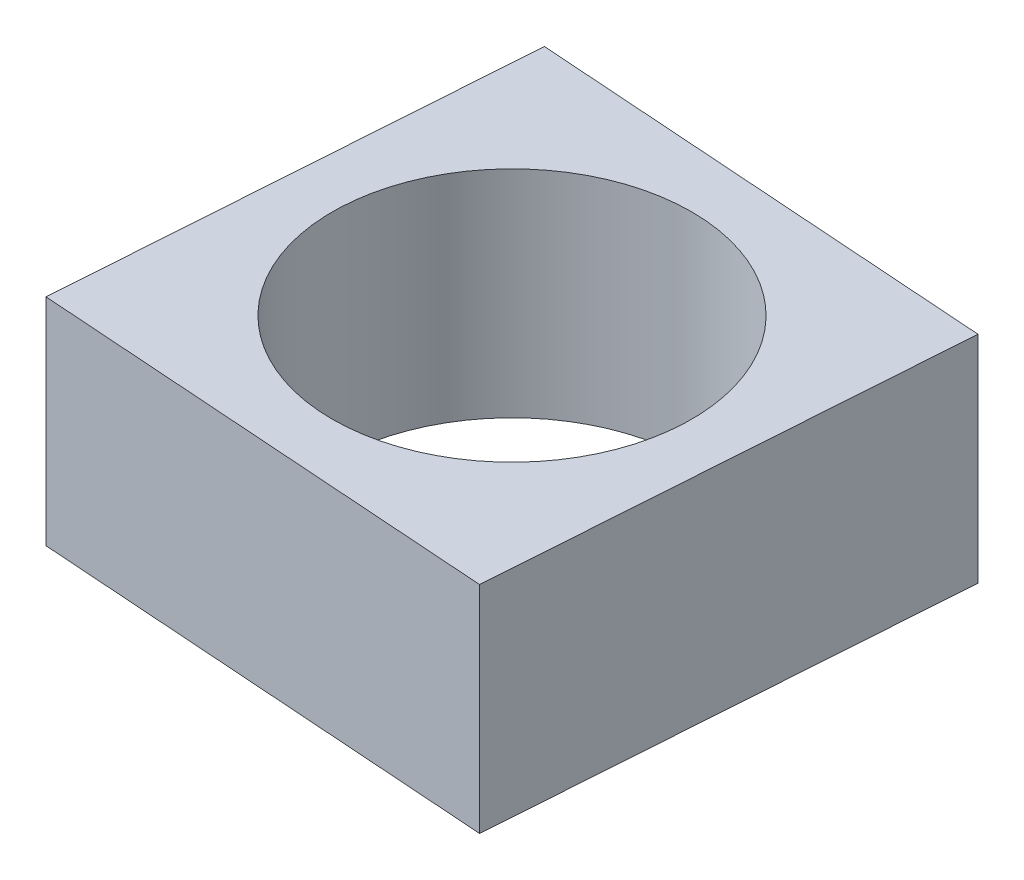
ISO-10303-21;
HEADER;
FILE_DESCRIPTION(('STEP AP214'),'2;1');
FILE_NAME('part.step','',(''),(''),'','','');
FILE_SCHEMA(('AUTOMOTIVE_DESIGN { 1 0 10303 214 1 1 1 1 }'));
ENDSEC;
DATA;
#1=APPLICATION_CONTEXT('core data for automotive mechanical design processes');
#2=APPLICATION_PROTOCOL_DEFINITION('international standard','automotive_design',2000,#1);
#3=PRODUCT_CONTEXT('',#1,'mechanical');
#4=PRODUCT('Part','Part','',(#3));
#5=PRODUCT_RELATED_PRODUCT_CATEGORY('part','',(#4));
#6=PRODUCT_DEFINITION_FORMATION('','',#4);
#7=PRODUCT_DEFINITION_CONTEXT('part definition',#1,'design');
#8=PRODUCT_DEFINITION('design','',#6,#7);
#9=PRODUCT_DEFINITION_SHAPE('','',#8);
#10=(LENGTH_UNIT() NAMED_UNIT(*) SI_UNIT(.MILLI.,.METRE.));
#11=(NAMED_UNIT(*) PLANE_ANGLE_UNIT() SI_UNIT($,.RADIAN.));
#12=(NAMED_UNIT(*) SI_UNIT($,.STERADIAN.) SOLID_ANGLE_UNIT());
#13=UNCERTAINTY_MEASURE_WITH_UNIT(LENGTH_MEASURE(1.E-05),#10,'distance_accuracy_value','');
#14=(GEOMETRIC_REPRESENTATION_CONTEXT(3) GLOBAL_UNCERTAINTY_ASSIGNED_CONTEXT((#13)) GLOBAL_UNIT_ASSIGNED_CONTEXT((#10,
#11,#12)) REPRESENTATION_CONTEXT('',''));
#15=CARTESIAN_POINT('',(0.,0.,0.));
#16=DIRECTION('',(0.,0.,1.));
#17=DIRECTION('',(1.,0.,0.));
#18=AXIS2_PLACEMENT_3D('',#15,#16,#17);
#19=CARTESIAN_POINT('',(-6.48435069474378,3.,-0.450772744934531));
#20=DIRECTION('',(0.069349653066851,0.,-0.997592414575967));
#21=DIRECTION('',(-0.997592414575967,0.,-0.069349653066851));
#22=AXIS2_PLACEMENT_3D('',#19,#20,#21);
#23=PLANE('',#22);
#24=DIRECTION('',(0.997592414575967,0.,0.069349653066851));
#25=VECTOR('',#24,1.);
#26=CARTESIAN_POINT('',(-6.48435069474378,0.,-0.450772744934531));
#27=LINE('',#26,#25);
#28=CARTESIAN_POINT('',(-6.48435069474378,0.,-0.450772744934531));
#29=VERTEX_POINT('',#28);
#30=CARTESIAN_POINT('',(0.,0.,0.));
#31=VERTEX_POINT('',#30);
#32=EDGE_CURVE('E107',#29,#31,#27,.T.);
#33=ORIENTED_EDGE('',*,*,#32,.T.);
#34=DIRECTION('',(0.,-1.,0.));
#35=VECTOR('',#34,1.);
#36=CARTESIAN_POINT('',(0.,3.,0.));
#37=LINE('',#36,#35);
#38=CARTESIAN_POINT('',(0.,3.,0.));
#39=VERTEX_POINT('',#38);
#40=EDGE_CURVE('E11',#39,#31,#37,.T.);
#41=ORIENTED_EDGE('',*,*,#40,.F.);
#42=DIRECTION('',(0.997592414575967,0.,0.069349653066851));
#43=VECTOR('',#42,1.);
#44=CARTESIAN_POINT('',(-6.48435069474378,3.,-0.450772744934531));
#45=LINE('',#44,#43);
#46=CARTESIAN_POINT('',(-6.48435069474378,3.,-0.450772744934531));
#47=VERTEX_POINT('',#46);
#48=EDGE_CURVE('E91',#47,#39,#45,.T.);
#49=ORIENTED_EDGE('',*,*,#48,.F.);
#50=DIRECTION('',(0.,-1.,0.));
#51=VECTOR('',#50,1.);
#52=CARTESIAN_POINT('',(-6.48435069474378,3.,-0.450772744934531));
#53=LINE('',#52,#51);
#54=EDGE_CURVE('E103',#47,#29,#53,.T.);
#55=ORIENTED_EDGE('',*,*,#54,.T.);
#56=EDGE_LOOP('',(#33,#41,#49,#55));
#57=FACE_BOUND('',#56,.T.);
#58=ADVANCED_FACE('F39',(#57),#23,.F.);
#59=CARTESIAN_POINT('',(0.,3.,0.));
#60=DIRECTION('',(-0.997592414575967,0.,-0.0693496530668509));
#61=DIRECTION('',(-0.0693496530668509,0.,0.997592414575967));
#62=AXIS2_PLACEMENT_3D('',#59,#60,#61);
#63=PLANE('',#62);
#64=DIRECTION('',(0.0693496530668509,0.,-0.997592414575967));
#65=VECTOR('',#64,1.);
#66=CARTESIAN_POINT('',(0.,0.,0.));
#67=LINE('',#66,#65);
#68=CARTESIAN_POINT('',(0.450772744934531,0.,-6.48435069474378));
#69=VERTEX_POINT('',#68);
#70=EDGE_CURVE('E96',#31,#69,#67,.T.);
#71=ORIENTED_EDGE('',*,*,#70,.T.);
#72=DIRECTION('',(0.,-1.,0.));
#73=VECTOR('',#72,1.);
#74=CARTESIAN_POINT('',(0.450772744934531,3.,-6.48435069474378));
#75=LINE('',#74,#73);
#76=CARTESIAN_POINT('',(0.450772744934531,3.,-6.48435069474378));
#77=VERTEX_POINT('',#76);
#78=EDGE_CURVE('E48',#77,#69,#75,.T.);
#79=ORIENTED_EDGE('',*,*,#78,.F.);
#80=DIRECTION('',(0.0693496530668509,0.,-0.997592414575967));
#81=VECTOR('',#80,1.);
#82=CARTESIAN_POINT('',(0.,3.,0.));
#83=LINE('',#82,#81);
#84=EDGE_CURVE('E86',#39,#77,#83,.T.);
#85=ORIENTED_EDGE('',*,*,#84,.F.);
#86=ORIENTED_EDGE('',*,*,#40,.T.);
#87=EDGE_LOOP('',(#71,#79,#85,#86));
#88=FACE_BOUND('',#87,.T.);
#89=ADVANCED_FACE('F95',(#88),#63,.F.);
#90=CARTESIAN_POINT('',(0.450772744934531,3.,-6.48435069474378));
#91=DIRECTION('',(-0.0693496530668509,0.,0.997592414575967));
#92=DIRECTION('',(0.997592414575967,0.,0.0693496530668509));
#93=AXIS2_PLACEMENT_3D('',#90,#91,#92);
#94=PLANE('',#93);
#95=DIRECTION('',(-0.997592414575967,0.,-0.0693496530668509));
#96=VECTOR('',#95,1.);
#97=CARTESIAN_POINT('',(0.450772744934531,0.,-6.48435069474378));
#98=LINE('',#97,#96);
#99=CARTESIAN_POINT('',(-6.03357794980925,0.,-6.93512343967831));
#100=VERTEX_POINT('',#99);
#101=EDGE_CURVE('E73',#69,#100,#98,.T.);
#102=ORIENTED_EDGE('',*,*,#101,.T.);
#103=DIRECTION('',(0.,-1.,0.));
#104=VECTOR('',#103,1.);
#105=CARTESIAN_POINT('',(-6.03357794980925,3.,-6.93512343967831));
#106=LINE('',#105,#104);
#107=CARTESIAN_POINT('',(-6.03357794980925,3.,-6.93512343967831));
#108=VERTEX_POINT('',#107);
#109=EDGE_CURVE('E98',#108,#100,#106,.T.);
#110=ORIENTED_EDGE('',*,*,#109,.F.);
#111=DIRECTION('',(-0.997592414575967,0.,-0.0693496530668509));
#112=VECTOR('',#111,1.);
#113=CARTESIAN_POINT('',(0.450772744934531,3.,-6.48435069474378));
#114=LINE('',#113,#112);
#115=EDGE_CURVE('E89',#77,#108,#114,.T.);
#116=ORIENTED_EDGE('',*,*,#115,.F.);
#117=ORIENTED_EDGE('',*,*,#78,.T.);
#118=EDGE_LOOP('',(#102,#110,#116,#117));
#119=FACE_BOUND('',#118,.T.);
#120=ADVANCED_FACE('F99',(#119),#94,.F.);
#121=CARTESIAN_POINT('',(-6.03357794980925,3.,-6.93512343967831));
#122=DIRECTION('',(0.997592414575967,0.,0.0693496530668505));
#123=DIRECTION('',(0.0693496530668505,0.,-0.997592414575967));
#124=AXIS2_PLACEMENT_3D('',#121,#122,#123);
#125=PLANE('',#124);
#126=DIRECTION('',(-0.0693496530668505,0.,0.997592414575967));
#127=VECTOR('',#126,1.);
#128=CARTESIAN_POINT('',(-6.03357794980925,0.,-6.93512343967831));
#129=LINE('',#128,#127);
#130=EDGE_CURVE('E79',#100,#29,#129,.T.);
#131=ORIENTED_EDGE('',*,*,#130,.T.);
#132=ORIENTED_EDGE('',*,*,#54,.F.);
#133=DIRECTION('',(-0.0693496530668505,0.,0.997592414575967));
#134=VECTOR('',#133,1.);
#135=CARTESIAN_POINT('',(-6.03357794980925,3.,-6.93512343967831));
#136=LINE('',#135,#134);
#137=EDGE_CURVE('E56',#108,#47,#136,.T.);
#138=ORIENTED_EDGE('',*,*,#137,.F.);
#139=ORIENTED_EDGE('',*,*,#109,.T.);
#140=EDGE_LOOP('',(#131,#132,#138,#139));
#141=FACE_BOUND('',#140,.T.);
#142=ADVANCED_FACE('F121',(#141),#125,.F.);
#143=CARTESIAN_POINT('',(0.,3.,0.));
#144=DIRECTION('',(0.,1.,0.));
#145=DIRECTION('',(0.,0.,1.));
#146=AXIS2_PLACEMENT_3D('',#143,#144,#145);
#147=PLANE('',#146);
#148=CARTESIAN_POINT('',(-3.01678897490463,3.,-3.46756171983916));
#149=DIRECTION('',(0.,1.,0.));
#150=DIRECTION('',(0.,0.,1.));
#151=AXIS2_PLACEMENT_3D('',#148,#149,#150);
#152=CIRCLE('',#151,2.5);
#153=CARTESIAN_POINT('',(-3.01678897490463,3.,-0.967561719839157));
#154=VERTEX_POINT('',#153);
#155=EDGE_CURVE('E128',#154,#154,#152,.T.);
#156=ORIENTED_EDGE('',*,*,#155,.F.);
#157=EDGE_LOOP('',(#156));
#158=FACE_BOUND('',#157,.T.);
#159=ORIENTED_EDGE('',*,*,#48,.T.);
#160=ORIENTED_EDGE('',*,*,#84,.T.);
#161=ORIENTED_EDGE('',*,*,#115,.T.);
#162=ORIENTED_EDGE('',*,*,#137,.T.);
#163=EDGE_LOOP('',(#159,#160,#161,#162));
#164=FACE_BOUND('',#163,.T.);
#165=ADVANCED_FACE('F87',(#158,#164),#147,.T.);
#166=CARTESIAN_POINT('',(0.,0.,0.));
#167=DIRECTION('',(0.,1.,0.));
#168=DIRECTION('',(0.,0.,1.));
#169=AXIS2_PLACEMENT_3D('',#166,#167,#168);
#170=PLANE('',#169);
#171=CARTESIAN_POINT('',(-3.01678897490463,0.,-3.46756171983916));
#172=DIRECTION('',(0.,1.,0.));
#173=DIRECTION('',(0.,0.,1.));
#174=AXIS2_PLACEMENT_3D('',#171,#172,#173);
#175=CIRCLE('',#174,2.5);
#176=CARTESIAN_POINT('',(-3.01678897490463,0.,-0.967561719839157));
#177=VERTEX_POINT('',#176);
#178=EDGE_CURVE('E111',#177,#177,#175,.T.);
#179=ORIENTED_EDGE('',*,*,#178,.T.);
#180=EDGE_LOOP('',(#179));
#181=FACE_BOUND('',#180,.T.);
#182=ORIENTED_EDGE('',*,*,#32,.F.);
#183=ORIENTED_EDGE('',*,*,#130,.F.);
#184=ORIENTED_EDGE('',*,*,#101,.F.);
#185=ORIENTED_EDGE('',*,*,#70,.F.);
#186=EDGE_LOOP('',(#182,#183,#184,#185));
#187=FACE_BOUND('',#186,.T.);
#188=ADVANCED_FACE('F124',(#181,#187),#170,.F.);
#189=CARTESIAN_POINT('',(-3.01678897490463,0.,-3.46756171983916));
#190=DIRECTION('',(0.,1.,0.));
#191=DIRECTION('',(0.,0.,1.));
#192=AXIS2_PLACEMENT_3D('',#189,#190,#191);
#193=CYLINDRICAL_SURFACE('',#192,2.5);
#194=ORIENTED_EDGE('',*,*,#178,.F.);
#195=EDGE_LOOP('',(#194));
#196=FACE_BOUND('',#195,.T.);
#197=ORIENTED_EDGE('',*,*,#155,.T.);
#198=EDGE_LOOP('',(#197));
#199=FACE_BOUND('',#198,.T.);
#200=ADVANCED_FACE('F137',(#196,#199),#193,.F.);
#201=CLOSED_SHELL('',(#58,#89,#120,#142,#165,#188,#200));
#202=MANIFOLD_SOLID_BREP('B2',#201);
#203=ADVANCED_BREP_SHAPE_REPRESENTATION('',(#18,#202),#14);
#204=SHAPE_DEFINITION_REPRESENTATION(#9,#203);
ENDSEC;
END-ISO-10303-21;
